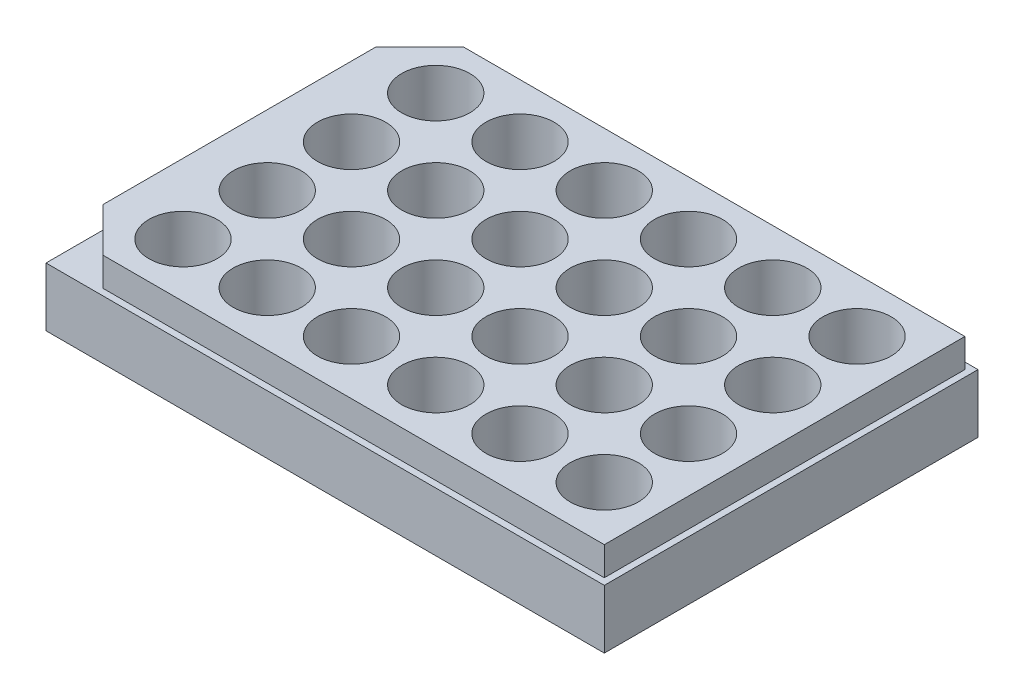
ISO-10303-21;
HEADER;
FILE_DESCRIPTION(('STEP AP214'),'2;1');
FILE_NAME('part.step','',(''),(''),'','','');
FILE_SCHEMA(('AUTOMOTIVE_DESIGN { 1 0 10303 214 1 1 1 1 }'));
ENDSEC;
DATA;
#1=APPLICATION_CONTEXT('core data for automotive mechanical design processes');
#2=APPLICATION_PROTOCOL_DEFINITION('international standard','automotive_design',2000,#1);
#3=PRODUCT_CONTEXT('',#1,'mechanical');
#4=PRODUCT('Part','Part','',(#3));
#5=PRODUCT_RELATED_PRODUCT_CATEGORY('part','',(#4));
#6=PRODUCT_DEFINITION_FORMATION('','',#4);
#7=PRODUCT_DEFINITION_CONTEXT('part definition',#1,'design');
#8=PRODUCT_DEFINITION('design','',#6,#7);
#9=PRODUCT_DEFINITION_SHAPE('','',#8);
#10=(LENGTH_UNIT() NAMED_UNIT(*) SI_UNIT(.MILLI.,.METRE.));
#11=(NAMED_UNIT(*) PLANE_ANGLE_UNIT() SI_UNIT($,.RADIAN.));
#12=(NAMED_UNIT(*) SI_UNIT($,.STERADIAN.) SOLID_ANGLE_UNIT());
#13=UNCERTAINTY_MEASURE_WITH_UNIT(LENGTH_MEASURE(1.E-05),#10,'distance_accuracy_value','');
#14=(GEOMETRIC_REPRESENTATION_CONTEXT(3) GLOBAL_UNCERTAINTY_ASSIGNED_CONTEXT((#13)) GLOBAL_UNIT_ASSIGNED_CONTEXT((#10,
#11,#12)) REPRESENTATION_CONTEXT('',''));
#15=CARTESIAN_POINT('',(0.,0.,0.));
#16=DIRECTION('',(0.,0.,1.));
#17=DIRECTION('',(1.,0.,0.));
#18=AXIS2_PLACEMENT_3D('',#15,#16,#17);
#19=CARTESIAN_POINT('',(0.,20.02,0.));
#20=DIRECTION('',(0.,1.,0.));
#21=DIRECTION('',(0.,0.,1.));
#22=AXIS2_PLACEMENT_3D('',#19,#20,#21);
#23=PLANE('',#22);
#24=DIRECTION('',(-0.707106781186548,0.,-0.707106781186547));
#25=VECTOR('',#24,1.);
#26=CARTESIAN_POINT('',(-62.445,20.02,31.3));
#27=LINE('',#26,#25);
#28=CARTESIAN_POINT('',(-52.445,20.02,41.3));
#29=VERTEX_POINT('',#28);
#30=CARTESIAN_POINT('',(-62.445,20.02,31.3));
#31=VERTEX_POINT('',#30);
#32=EDGE_CURVE('E117',#29,#31,#27,.T.);
#33=ORIENTED_EDGE('',*,*,#32,.F.);
#34=DIRECTION('',(1.,0.,0.));
#35=VECTOR('',#34,1.);
#36=CARTESIAN_POINT('',(62.445,20.02,41.3));
#37=LINE('',#36,#35);
#38=CARTESIAN_POINT('',(62.445,20.02,41.3));
#39=VERTEX_POINT('',#38);
#40=EDGE_CURVE('E125',#29,#39,#37,.T.);
#41=ORIENTED_EDGE('',*,*,#40,.T.);
#42=DIRECTION('',(0.,0.,-1.));
#43=VECTOR('',#42,1.);
#44=CARTESIAN_POINT('',(62.445,20.02,-41.3));
#45=LINE('',#44,#43);
#46=CARTESIAN_POINT('',(62.445,20.02,-41.3));
#47=VERTEX_POINT('',#46);
#48=EDGE_CURVE('E141',#39,#47,#45,.T.);
#49=ORIENTED_EDGE('',*,*,#48,.T.);
#50=DIRECTION('',(-1.,0.,0.));
#51=VECTOR('',#50,1.);
#52=CARTESIAN_POINT('',(62.445,20.02,-41.3));
#53=LINE('',#52,#51);
#54=CARTESIAN_POINT('',(-52.445,20.02,-41.3));
#55=VERTEX_POINT('',#54);
#56=EDGE_CURVE('E144',#47,#55,#53,.T.);
#57=ORIENTED_EDGE('',*,*,#56,.T.);
#58=DIRECTION('',(0.707106781186548,0.,-0.707106781186547));
#59=VECTOR('',#58,1.);
#60=CARTESIAN_POINT('',(-52.445,20.02,-41.3));
#61=LINE('',#60,#59);
#62=CARTESIAN_POINT('',(-62.445,20.02,-31.3));
#63=VERTEX_POINT('',#62);
#64=EDGE_CURVE('E714',#63,#55,#61,.T.);
#65=ORIENTED_EDGE('',*,*,#64,.F.);
#66=DIRECTION('',(0.,0.,1.));
#67=VECTOR('',#66,1.);
#68=CARTESIAN_POINT('',(-62.445,20.02,-41.3));
#69=LINE('',#68,#67);
#70=EDGE_CURVE('E148',#63,#31,#69,.T.);
#71=ORIENTED_EDGE('',*,*,#70,.T.);
#72=EDGE_LOOP('',(#33,#41,#49,#57,#65,#71));
#73=FACE_BOUND('',#72,.T.);
#74=CARTESIAN_POINT('',(-46.425,20.02,-28.96));
#75=DIRECTION('',(0.,1.,0.));
#76=DIRECTION('',(0.,0.,1.));
#77=AXIS2_PLACEMENT_3D('',#74,#75,#76);
#78=CIRCLE('',#77,7.81);
#79=CARTESIAN_POINT('',(-46.425,20.02,-21.15));
#80=VERTEX_POINT('',#79);
#81=EDGE_CURVE('E297',#80,#80,#78,.T.);
#82=ORIENTED_EDGE('',*,*,#81,.F.);
#83=EDGE_LOOP('',(#82));
#84=FACE_BOUND('',#83,.T.);
#85=CARTESIAN_POINT('',(-27.125,20.02,-28.96));
#86=DIRECTION('',(0.,1.,0.));
#87=DIRECTION('',(0.,0.,1.));
#88=AXIS2_PLACEMENT_3D('',#85,#86,#87);
#89=CIRCLE('',#88,7.81);
#90=CARTESIAN_POINT('',(-27.125,20.02,-21.15));
#91=VERTEX_POINT('',#90);
#92=EDGE_CURVE('E291',#91,#91,#89,.T.);
#93=ORIENTED_EDGE('',*,*,#92,.F.);
#94=EDGE_LOOP('',(#93));
#95=FACE_BOUND('',#94,.T.);
#96=CARTESIAN_POINT('',(-7.82499999999999,20.02,-28.96));
#97=DIRECTION('',(0.,1.,0.));
#98=DIRECTION('',(0.,0.,1.));
#99=AXIS2_PLACEMENT_3D('',#96,#97,#98);
#100=CIRCLE('',#99,7.81);
#101=CARTESIAN_POINT('',(-7.82499999999999,20.02,-21.15));
#102=VERTEX_POINT('',#101);
#103=EDGE_CURVE('E285',#102,#102,#100,.T.);
#104=ORIENTED_EDGE('',*,*,#103,.F.);
#105=EDGE_LOOP('',(#104));
#106=FACE_BOUND('',#105,.T.);
#107=CARTESIAN_POINT('',(11.475,20.02,-28.96));
#108=DIRECTION('',(0.,1.,0.));
#109=DIRECTION('',(0.,0.,1.));
#110=AXIS2_PLACEMENT_3D('',#107,#108,#109);
#111=CIRCLE('',#110,7.81);
#112=CARTESIAN_POINT('',(11.475,20.02,-21.15));
#113=VERTEX_POINT('',#112);
#114=EDGE_CURVE('E279',#113,#113,#111,.T.);
#115=ORIENTED_EDGE('',*,*,#114,.F.);
#116=EDGE_LOOP('',(#115));
#117=FACE_BOUND('',#116,.T.);
#118=CARTESIAN_POINT('',(30.775,20.02,-28.96));
#119=DIRECTION('',(0.,1.,0.));
#120=DIRECTION('',(0.,0.,1.));
#121=AXIS2_PLACEMENT_3D('',#118,#119,#120);
#122=CIRCLE('',#121,7.81);
#123=CARTESIAN_POINT('',(30.775,20.02,-21.15));
#124=VERTEX_POINT('',#123);
#125=EDGE_CURVE('E273',#124,#124,#122,.T.);
#126=ORIENTED_EDGE('',*,*,#125,.F.);
#127=EDGE_LOOP('',(#126));
#128=FACE_BOUND('',#127,.T.);
#129=CARTESIAN_POINT('',(50.075,20.02,-28.96));
#130=DIRECTION('',(0.,1.,0.));
#131=DIRECTION('',(0.,0.,1.));
#132=AXIS2_PLACEMENT_3D('',#129,#130,#131);
#133=CIRCLE('',#132,7.81);
#134=CARTESIAN_POINT('',(50.075,20.02,-21.15));
#135=VERTEX_POINT('',#134);
#136=EDGE_CURVE('E267',#135,#135,#133,.T.);
#137=ORIENTED_EDGE('',*,*,#136,.F.);
#138=EDGE_LOOP('',(#137));
#139=FACE_BOUND('',#138,.T.);
#140=CARTESIAN_POINT('',(-27.1249999999998,20.02,-9.65999999999998));
#141=DIRECTION('',(0.,1.,0.));
#142=DIRECTION('',(0.,0.,1.));
#143=AXIS2_PLACEMENT_3D('',#140,#141,#142);
#144=CIRCLE('',#143,7.81);
#145=CARTESIAN_POINT('',(-27.1249999999998,20.02,-1.84999999999998));
#146=VERTEX_POINT('',#145);
#147=EDGE_CURVE('E261',#146,#146,#144,.T.);
#148=ORIENTED_EDGE('',*,*,#147,.F.);
#149=EDGE_LOOP('',(#148));
#150=FACE_BOUND('',#149,.T.);
#151=CARTESIAN_POINT('',(-7.82499999999979,20.02,-9.65999999999998));
#152=DIRECTION('',(0.,1.,0.));
#153=DIRECTION('',(0.,0.,1.));
#154=AXIS2_PLACEMENT_3D('',#151,#152,#153);
#155=CIRCLE('',#154,7.81);
#156=CARTESIAN_POINT('',(-7.82499999999979,20.02,-1.84999999999999));
#157=VERTEX_POINT('',#156);
#158=EDGE_CURVE('E255',#157,#157,#155,.T.);
#159=ORIENTED_EDGE('',*,*,#158,.F.);
#160=EDGE_LOOP('',(#159));
#161=FACE_BOUND('',#160,.T.);
#162=CARTESIAN_POINT('',(11.4750000000002,20.02,-9.65999999999998));
#163=DIRECTION('',(0.,1.,0.));
#164=DIRECTION('',(0.,0.,1.));
#165=AXIS2_PLACEMENT_3D('',#162,#163,#164);
#166=CIRCLE('',#165,7.81);
#167=CARTESIAN_POINT('',(11.4750000000002,20.02,-1.84999999999999));
#168=VERTEX_POINT('',#167);
#169=EDGE_CURVE('E249',#168,#168,#166,.T.);
#170=ORIENTED_EDGE('',*,*,#169,.F.);
#171=EDGE_LOOP('',(#170));
#172=FACE_BOUND('',#171,.T.);
#173=CARTESIAN_POINT('',(30.7750000000002,20.02,-9.65999999999998));
#174=DIRECTION('',(0.,1.,0.));
#175=DIRECTION('',(0.,0.,1.));
#176=AXIS2_PLACEMENT_3D('',#173,#174,#175);
#177=CIRCLE('',#176,7.81);
#178=CARTESIAN_POINT('',(30.7750000000002,20.02,-1.84999999999999));
#179=VERTEX_POINT('',#178);
#180=EDGE_CURVE('E243',#179,#179,#177,.T.);
#181=ORIENTED_EDGE('',*,*,#180,.F.);
#182=EDGE_LOOP('',(#181));
#183=FACE_BOUND('',#182,.T.);
#184=CARTESIAN_POINT('',(50.0750000000002,20.02,-9.65999999999998));
#185=DIRECTION('',(0.,1.,0.));
#186=DIRECTION('',(0.,0.,1.));
#187=AXIS2_PLACEMENT_3D('',#184,#185,#186);
#188=CIRCLE('',#187,7.81);
#189=CARTESIAN_POINT('',(50.0750000000002,20.02,-1.84999999999999));
#190=VERTEX_POINT('',#189);
#191=EDGE_CURVE('E237',#190,#190,#188,.T.);
#192=ORIENTED_EDGE('',*,*,#191,.F.);
#193=EDGE_LOOP('',(#192));
#194=FACE_BOUND('',#193,.T.);
#195=CARTESIAN_POINT('',(-27.1249999999996,20.02,9.64000000000002));
#196=DIRECTION('',(0.,1.,0.));
#197=DIRECTION('',(0.,0.,1.));
#198=AXIS2_PLACEMENT_3D('',#195,#196,#197);
#199=CIRCLE('',#198,7.81);
#200=CARTESIAN_POINT('',(-27.1249999999996,20.02,17.45));
#201=VERTEX_POINT('',#200);
#202=EDGE_CURVE('E231',#201,#201,#199,.T.);
#203=ORIENTED_EDGE('',*,*,#202,.F.);
#204=EDGE_LOOP('',(#203));
#205=FACE_BOUND('',#204,.T.);
#206=CARTESIAN_POINT('',(-7.82499999999959,20.02,9.64000000000002));
#207=DIRECTION('',(0.,1.,0.));
#208=DIRECTION('',(0.,0.,1.));
#209=AXIS2_PLACEMENT_3D('',#206,#207,#208);
#210=CIRCLE('',#209,7.81);
#211=CARTESIAN_POINT('',(-7.82499999999959,20.02,17.45));
#212=VERTEX_POINT('',#211);
#213=EDGE_CURVE('E225',#212,#212,#210,.T.);
#214=ORIENTED_EDGE('',*,*,#213,.F.);
#215=EDGE_LOOP('',(#214));
#216=FACE_BOUND('',#215,.T.);
#217=CARTESIAN_POINT('',(11.4750000000004,20.02,9.64000000000002));
#218=DIRECTION('',(0.,1.,0.));
#219=DIRECTION('',(0.,0.,1.));
#220=AXIS2_PLACEMENT_3D('',#217,#218,#219);
#221=CIRCLE('',#220,7.81);
#222=CARTESIAN_POINT('',(11.4750000000004,20.02,17.45));
#223=VERTEX_POINT('',#222);
#224=EDGE_CURVE('E219',#223,#223,#221,.T.);
#225=ORIENTED_EDGE('',*,*,#224,.F.);
#226=EDGE_LOOP('',(#225));
#227=FACE_BOUND('',#226,.T.);
#228=CARTESIAN_POINT('',(30.7750000000004,20.02,9.64000000000002));
#229=DIRECTION('',(0.,1.,0.));
#230=DIRECTION('',(0.,0.,1.));
#231=AXIS2_PLACEMENT_3D('',#228,#229,#230);
#232=CIRCLE('',#231,7.81);
#233=CARTESIAN_POINT('',(30.7750000000004,20.02,17.45));
#234=VERTEX_POINT('',#233);
#235=EDGE_CURVE('E213',#234,#234,#232,.T.);
#236=ORIENTED_EDGE('',*,*,#235,.F.);
#237=EDGE_LOOP('',(#236));
#238=FACE_BOUND('',#237,.T.);
#239=CARTESIAN_POINT('',(50.0750000000004,20.02,9.64000000000002));
#240=DIRECTION('',(0.,1.,0.));
#241=DIRECTION('',(0.,0.,1.));
#242=AXIS2_PLACEMENT_3D('',#239,#240,#241);
#243=CIRCLE('',#242,7.81);
#244=CARTESIAN_POINT('',(50.0750000000004,20.02,17.45));
#245=VERTEX_POINT('',#244);
#246=EDGE_CURVE('E207',#245,#245,#243,.T.);
#247=ORIENTED_EDGE('',*,*,#246,.F.);
#248=EDGE_LOOP('',(#247));
#249=FACE_BOUND('',#248,.T.);
#250=CARTESIAN_POINT('',(-27.1249999999994,20.02,28.94));
#251=DIRECTION('',(0.,1.,0.));
#252=DIRECTION('',(0.,0.,1.));
#253=AXIS2_PLACEMENT_3D('',#250,#251,#252);
#254=CIRCLE('',#253,7.81);
#255=CARTESIAN_POINT('',(-27.1249999999994,20.02,36.75));
#256=VERTEX_POINT('',#255);
#257=EDGE_CURVE('E201',#256,#256,#254,.T.);
#258=ORIENTED_EDGE('',*,*,#257,.F.);
#259=EDGE_LOOP('',(#258));
#260=FACE_BOUND('',#259,.T.);
#261=CARTESIAN_POINT('',(-7.82499999999939,20.02,28.94));
#262=DIRECTION('',(0.,1.,0.));
#263=DIRECTION('',(0.,0.,1.));
#264=AXIS2_PLACEMENT_3D('',#261,#262,#263);
#265=CIRCLE('',#264,7.81);
#266=CARTESIAN_POINT('',(-7.82499999999939,20.02,36.75));
#267=VERTEX_POINT('',#266);
#268=EDGE_CURVE('E195',#267,#267,#265,.T.);
#269=ORIENTED_EDGE('',*,*,#268,.F.);
#270=EDGE_LOOP('',(#269));
#271=FACE_BOUND('',#270,.T.);
#272=CARTESIAN_POINT('',(11.4750000000006,20.02,28.94));
#273=DIRECTION('',(0.,1.,0.));
#274=DIRECTION('',(0.,0.,1.));
#275=AXIS2_PLACEMENT_3D('',#272,#273,#274);
#276=CIRCLE('',#275,7.81);
#277=CARTESIAN_POINT('',(11.4750000000006,20.02,36.75));
#278=VERTEX_POINT('',#277);
#279=EDGE_CURVE('E189',#278,#278,#276,.T.);
#280=ORIENTED_EDGE('',*,*,#279,.F.);
#281=EDGE_LOOP('',(#280));
#282=FACE_BOUND('',#281,.T.);
#283=CARTESIAN_POINT('',(30.7750000000006,20.02,28.94));
#284=DIRECTION('',(0.,1.,0.));
#285=DIRECTION('',(0.,0.,1.));
#286=AXIS2_PLACEMENT_3D('',#283,#284,#285);
#287=CIRCLE('',#286,7.81);
#288=CARTESIAN_POINT('',(30.7750000000006,20.02,36.75));
#289=VERTEX_POINT('',#288);
#290=EDGE_CURVE('E183',#289,#289,#287,.T.);
#291=ORIENTED_EDGE('',*,*,#290,.F.);
#292=EDGE_LOOP('',(#291));
#293=FACE_BOUND('',#292,.T.);
#294=CARTESIAN_POINT('',(50.0750000000006,20.02,28.94));
#295=DIRECTION('',(0.,1.,0.));
#296=DIRECTION('',(0.,0.,1.));
#297=AXIS2_PLACEMENT_3D('',#294,#295,#296);
#298=CIRCLE('',#297,7.81);
#299=CARTESIAN_POINT('',(50.0750000000006,20.02,36.75));
#300=VERTEX_POINT('',#299);
#301=EDGE_CURVE('E177',#300,#300,#298,.T.);
#302=ORIENTED_EDGE('',*,*,#301,.F.);
#303=EDGE_LOOP('',(#302));
#304=FACE_BOUND('',#303,.T.);
#305=CARTESIAN_POINT('',(-46.4249999999998,20.02,-9.65999999999998));
#306=DIRECTION('',(0.,1.,0.));
#307=DIRECTION('',(0.,0.,1.));
#308=AXIS2_PLACEMENT_3D('',#305,#306,#307);
#309=CIRCLE('',#308,7.81);
#310=CARTESIAN_POINT('',(-46.4249999999998,20.02,-1.84999999999999));
#311=VERTEX_POINT('',#310);
#312=EDGE_CURVE('E171',#311,#311,#309,.T.);
#313=ORIENTED_EDGE('',*,*,#312,.F.);
#314=EDGE_LOOP('',(#313));
#315=FACE_BOUND('',#314,.T.);
#316=CARTESIAN_POINT('',(-46.4249999999996,20.02,9.64000000000002));
#317=DIRECTION('',(0.,1.,0.));
#318=DIRECTION('',(0.,0.,1.));
#319=AXIS2_PLACEMENT_3D('',#316,#317,#318);
#320=CIRCLE('',#319,7.81);
#321=CARTESIAN_POINT('',(-46.4249999999996,20.02,17.45));
#322=VERTEX_POINT('',#321);
#323=EDGE_CURVE('E165',#322,#322,#320,.T.);
#324=ORIENTED_EDGE('',*,*,#323,.F.);
#325=EDGE_LOOP('',(#324));
#326=FACE_BOUND('',#325,.T.);
#327=CARTESIAN_POINT('',(-46.4249999999994,20.02,28.94));
#328=DIRECTION('',(0.,1.,0.));
#329=DIRECTION('',(0.,0.,1.));
#330=AXIS2_PLACEMENT_3D('',#327,#328,#329);
#331=CIRCLE('',#330,7.81);
#332=CARTESIAN_POINT('',(-46.4249999999994,20.02,36.75));
#333=VERTEX_POINT('',#332);
#334=EDGE_CURVE('E161',#333,#333,#331,.T.);
#335=ORIENTED_EDGE('',*,*,#334,.F.);
#336=EDGE_LOOP('',(#335));
#337=FACE_BOUND('',#336,.T.);
#338=ADVANCED_FACE('F36',(#73,#84,#95,#106,#117,#128,#139,#150,#161,#172,#183,#194,#205,#216,
#227,#238,#249,#260,#271,#282,#293,#304,#315,#326,#337),#23,.T.);
#339=CARTESIAN_POINT('',(63.945,20.02,-42.8));
#340=DIRECTION('',(-1.,0.,0.));
#341=DIRECTION('',(0.,0.,1.));
#342=AXIS2_PLACEMENT_3D('',#339,#340,#341);
#343=PLANE('',#342);
#344=DIRECTION('',(0.,-1.,0.));
#345=VECTOR('',#344,1.);
#346=CARTESIAN_POINT('',(63.945,20.02,-42.8));
#347=LINE('',#346,#345);
#348=CARTESIAN_POINT('',(63.945,13.45,-42.8));
#349=VERTEX_POINT('',#348);
#350=CARTESIAN_POINT('',(63.945,0.,-42.8));
#351=VERTEX_POINT('',#350);
#352=EDGE_CURVE('E11',#349,#351,#347,.T.);
#353=ORIENTED_EDGE('',*,*,#352,.F.);
#354=DIRECTION('',(0.,0.,-1.));
#355=VECTOR('',#354,1.);
#356=CARTESIAN_POINT('',(63.945,13.45,-42.8));
#357=LINE('',#356,#355);
#358=CARTESIAN_POINT('',(63.945,13.45,42.8));
#359=VERTEX_POINT('',#358);
#360=EDGE_CURVE('E157',#359,#349,#357,.T.);
#361=ORIENTED_EDGE('',*,*,#360,.F.);
#362=DIRECTION('',(0.,-1.,0.));
#363=VECTOR('',#362,1.);
#364=CARTESIAN_POINT('',(63.945,20.02,42.8));
#365=LINE('',#364,#363);
#366=CARTESIAN_POINT('',(63.945,0.,42.8));
#367=VERTEX_POINT('',#366);
#368=EDGE_CURVE('E317',#359,#367,#365,.T.);
#369=ORIENTED_EDGE('',*,*,#368,.T.);
#370=DIRECTION('',(0.,0.,-1.));
#371=VECTOR('',#370,1.);
#372=CARTESIAN_POINT('',(63.945,0.,-42.8));
#373=LINE('',#372,#371);
#374=EDGE_CURVE('E303',#367,#351,#373,.T.);
#375=ORIENTED_EDGE('',*,*,#374,.T.);
#376=EDGE_LOOP('',(#353,#361,#369,#375));
#377=FACE_BOUND('',#376,.T.);
#378=ADVANCED_FACE('F38',(#377),#343,.F.);
#379=CARTESIAN_POINT('',(-63.945,20.02,-42.8));
#380=DIRECTION('',(0.,0.,1.));
#381=DIRECTION('',(1.,0.,0.));
#382=AXIS2_PLACEMENT_3D('',#379,#380,#381);
#383=PLANE('',#382);
#384=DIRECTION('',(0.,-1.,0.));
#385=VECTOR('',#384,1.);
#386=CARTESIAN_POINT('',(-63.945,20.02,-42.8));
#387=LINE('',#386,#385);
#388=CARTESIAN_POINT('',(-63.945,13.45,-42.8));
#389=VERTEX_POINT('',#388);
#390=CARTESIAN_POINT('',(-63.945,0.,-42.8));
#391=VERTEX_POINT('',#390);
#392=EDGE_CURVE('E44',#389,#391,#387,.T.);
#393=ORIENTED_EDGE('',*,*,#392,.F.);
#394=DIRECTION('',(-1.,0.,0.));
#395=VECTOR('',#394,1.);
#396=CARTESIAN_POINT('',(63.945,13.45,-42.8));
#397=LINE('',#396,#395);
#398=EDGE_CURVE('E159',#349,#389,#397,.T.);
#399=ORIENTED_EDGE('',*,*,#398,.F.);
#400=ORIENTED_EDGE('',*,*,#352,.T.);
#401=DIRECTION('',(-1.,0.,0.));
#402=VECTOR('',#401,1.);
#403=CARTESIAN_POINT('',(-63.945,0.,-42.8));
#404=LINE('',#403,#402);
#405=EDGE_CURVE('E308',#351,#391,#404,.T.);
#406=ORIENTED_EDGE('',*,*,#405,.T.);
#407=EDGE_LOOP('',(#393,#399,#400,#406));
#408=FACE_BOUND('',#407,.T.);
#409=ADVANCED_FACE('F330',(#408),#383,.F.);
#410=CARTESIAN_POINT('',(-63.945,20.02,-42.8));
#411=DIRECTION('',(1.,0.,0.));
#412=DIRECTION('',(0.,0.,-1.));
#413=AXIS2_PLACEMENT_3D('',#410,#411,#412);
#414=PLANE('',#413);
#415=DIRECTION('',(0.,-1.,0.));
#416=VECTOR('',#415,1.);
#417=CARTESIAN_POINT('',(-63.945,20.02,42.8));
#418=LINE('',#417,#416);
#419=CARTESIAN_POINT('',(-63.945,13.45,42.8));
#420=VERTEX_POINT('',#419);
#421=CARTESIAN_POINT('',(-63.945,0.,42.8));
#422=VERTEX_POINT('',#421);
#423=EDGE_CURVE('E319',#420,#422,#418,.T.);
#424=ORIENTED_EDGE('',*,*,#423,.F.);
#425=DIRECTION('',(0.,0.,1.));
#426=VECTOR('',#425,1.);
#427=CARTESIAN_POINT('',(-63.945,13.45,-42.8));
#428=LINE('',#427,#426);
#429=EDGE_CURVE('E152',#389,#420,#428,.T.);
#430=ORIENTED_EDGE('',*,*,#429,.F.);
#431=ORIENTED_EDGE('',*,*,#392,.T.);
#432=DIRECTION('',(0.,0.,1.));
#433=VECTOR('',#432,1.);
#434=CARTESIAN_POINT('',(-63.945,0.,-42.8));
#435=LINE('',#434,#433);
#436=EDGE_CURVE('E311',#391,#422,#435,.T.);
#437=ORIENTED_EDGE('',*,*,#436,.T.);
#438=EDGE_LOOP('',(#424,#430,#431,#437));
#439=FACE_BOUND('',#438,.T.);
#440=ADVANCED_FACE('F324',(#439),#414,.F.);
#441=CARTESIAN_POINT('',(-63.945,20.02,42.8));
#442=DIRECTION('',(0.,0.,-1.));
#443=DIRECTION('',(-1.,0.,0.));
#444=AXIS2_PLACEMENT_3D('',#441,#442,#443);
#445=PLANE('',#444);
#446=ORIENTED_EDGE('',*,*,#368,.F.);
#447=DIRECTION('',(1.,0.,0.));
#448=VECTOR('',#447,1.);
#449=CARTESIAN_POINT('',(63.945,13.45,42.8));
#450=LINE('',#449,#448);
#451=EDGE_CURVE('E155',#420,#359,#450,.T.);
#452=ORIENTED_EDGE('',*,*,#451,.F.);
#453=ORIENTED_EDGE('',*,*,#423,.T.);
#454=DIRECTION('',(1.,0.,0.));
#455=VECTOR('',#454,1.);
#456=CARTESIAN_POINT('',(-63.945,0.,42.8));
#457=LINE('',#456,#455);
#458=EDGE_CURVE('E314',#422,#367,#457,.T.);
#459=ORIENTED_EDGE('',*,*,#458,.T.);
#460=EDGE_LOOP('',(#446,#452,#453,#459));
#461=FACE_BOUND('',#460,.T.);
#462=ADVANCED_FACE('F337',(#461),#445,.F.);
#463=CARTESIAN_POINT('',(0.,0.,0.));
#464=DIRECTION('',(0.,1.,0.));
#465=DIRECTION('',(0.,0.,1.));
#466=AXIS2_PLACEMENT_3D('',#463,#464,#465);
#467=PLANE('',#466);
#468=CARTESIAN_POINT('',(-46.4249999999994,0.,28.94));
#469=DIRECTION('',(0.,1.,0.));
#470=DIRECTION('',(0.,0.,1.));
#471=AXIS2_PLACEMENT_3D('',#468,#469,#470);
#472=CIRCLE('',#471,7.81);
#473=CARTESIAN_POINT('',(-46.4249999999994,0.,36.75));
#474=VERTEX_POINT('',#473);
#475=EDGE_CURVE('E162',#474,#474,#472,.T.);
#476=ORIENTED_EDGE('',*,*,#475,.T.);
#477=EDGE_LOOP('',(#476));
#478=FACE_BOUND('',#477,.T.);
#479=CARTESIAN_POINT('',(-46.4249999999996,0.,9.64000000000002));
#480=DIRECTION('',(0.,1.,0.));
#481=DIRECTION('',(0.,0.,1.));
#482=AXIS2_PLACEMENT_3D('',#479,#480,#481);
#483=CIRCLE('',#482,7.81);
#484=CARTESIAN_POINT('',(-46.4249999999996,0.,17.45));
#485=VERTEX_POINT('',#484);
#486=EDGE_CURVE('E168',#485,#485,#483,.T.);
#487=ORIENTED_EDGE('',*,*,#486,.T.);
#488=EDGE_LOOP('',(#487));
#489=FACE_BOUND('',#488,.T.);
#490=CARTESIAN_POINT('',(-46.4249999999998,0.,-9.65999999999998));
#491=DIRECTION('',(0.,1.,0.));
#492=DIRECTION('',(0.,0.,1.));
#493=AXIS2_PLACEMENT_3D('',#490,#491,#492);
#494=CIRCLE('',#493,7.81);
#495=CARTESIAN_POINT('',(-46.4249999999998,0.,-1.84999999999999));
#496=VERTEX_POINT('',#495);
#497=EDGE_CURVE('E174',#496,#496,#494,.T.);
#498=ORIENTED_EDGE('',*,*,#497,.T.);
#499=EDGE_LOOP('',(#498));
#500=FACE_BOUND('',#499,.T.);
#501=CARTESIAN_POINT('',(50.0750000000006,0.,28.94));
#502=DIRECTION('',(0.,1.,0.));
#503=DIRECTION('',(0.,0.,1.));
#504=AXIS2_PLACEMENT_3D('',#501,#502,#503);
#505=CIRCLE('',#504,7.81);
#506=CARTESIAN_POINT('',(50.0750000000006,0.,36.75));
#507=VERTEX_POINT('',#506);
#508=EDGE_CURVE('E180',#507,#507,#505,.T.);
#509=ORIENTED_EDGE('',*,*,#508,.T.);
#510=EDGE_LOOP('',(#509));
#511=FACE_BOUND('',#510,.T.);
#512=CARTESIAN_POINT('',(30.7750000000006,0.,28.94));
#513=DIRECTION('',(0.,1.,0.));
#514=DIRECTION('',(0.,0.,1.));
#515=AXIS2_PLACEMENT_3D('',#512,#513,#514);
#516=CIRCLE('',#515,7.81);
#517=CARTESIAN_POINT('',(30.7750000000006,0.,36.75));
#518=VERTEX_POINT('',#517);
#519=EDGE_CURVE('E186',#518,#518,#516,.T.);
#520=ORIENTED_EDGE('',*,*,#519,.T.);
#521=EDGE_LOOP('',(#520));
#522=FACE_BOUND('',#521,.T.);
#523=CARTESIAN_POINT('',(11.4750000000006,0.,28.94));
#524=DIRECTION('',(0.,1.,0.));
#525=DIRECTION('',(0.,0.,1.));
#526=AXIS2_PLACEMENT_3D('',#523,#524,#525);
#527=CIRCLE('',#526,7.81);
#528=CARTESIAN_POINT('',(11.4750000000006,0.,36.75));
#529=VERTEX_POINT('',#528);
#530=EDGE_CURVE('E192',#529,#529,#527,.T.);
#531=ORIENTED_EDGE('',*,*,#530,.T.);
#532=EDGE_LOOP('',(#531));
#533=FACE_BOUND('',#532,.T.);
#534=CARTESIAN_POINT('',(-7.82499999999939,0.,28.94));
#535=DIRECTION('',(0.,1.,0.));
#536=DIRECTION('',(0.,0.,1.));
#537=AXIS2_PLACEMENT_3D('',#534,#535,#536);
#538=CIRCLE('',#537,7.81);
#539=CARTESIAN_POINT('',(-7.82499999999939,0.,36.75));
#540=VERTEX_POINT('',#539);
#541=EDGE_CURVE('E198',#540,#540,#538,.T.);
#542=ORIENTED_EDGE('',*,*,#541,.T.);
#543=EDGE_LOOP('',(#542));
#544=FACE_BOUND('',#543,.T.);
#545=CARTESIAN_POINT('',(-27.1249999999994,0.,28.94));
#546=DIRECTION('',(0.,1.,0.));
#547=DIRECTION('',(0.,0.,1.));
#548=AXIS2_PLACEMENT_3D('',#545,#546,#547);
#549=CIRCLE('',#548,7.81);
#550=CARTESIAN_POINT('',(-27.1249999999994,0.,36.75));
#551=VERTEX_POINT('',#550);
#552=EDGE_CURVE('E204',#551,#551,#549,.T.);
#553=ORIENTED_EDGE('',*,*,#552,.T.);
#554=EDGE_LOOP('',(#553));
#555=FACE_BOUND('',#554,.T.);
#556=CARTESIAN_POINT('',(50.0750000000004,0.,9.64000000000002));
#557=DIRECTION('',(0.,1.,0.));
#558=DIRECTION('',(0.,0.,1.));
#559=AXIS2_PLACEMENT_3D('',#556,#557,#558);
#560=CIRCLE('',#559,7.81);
#561=CARTESIAN_POINT('',(50.0750000000004,0.,17.45));
#562=VERTEX_POINT('',#561);
#563=EDGE_CURVE('E210',#562,#562,#560,.T.);
#564=ORIENTED_EDGE('',*,*,#563,.T.);
#565=EDGE_LOOP('',(#564));
#566=FACE_BOUND('',#565,.T.);
#567=CARTESIAN_POINT('',(30.7750000000004,0.,9.64000000000002));
#568=DIRECTION('',(0.,1.,0.));
#569=DIRECTION('',(0.,0.,1.));
#570=AXIS2_PLACEMENT_3D('',#567,#568,#569);
#571=CIRCLE('',#570,7.81);
#572=CARTESIAN_POINT('',(30.7750000000004,0.,17.45));
#573=VERTEX_POINT('',#572);
#574=EDGE_CURVE('E216',#573,#573,#571,.T.);
#575=ORIENTED_EDGE('',*,*,#574,.T.);
#576=EDGE_LOOP('',(#575));
#577=FACE_BOUND('',#576,.T.);
#578=CARTESIAN_POINT('',(11.4750000000004,0.,9.64000000000002));
#579=DIRECTION('',(0.,1.,0.));
#580=DIRECTION('',(0.,0.,1.));
#581=AXIS2_PLACEMENT_3D('',#578,#579,#580);
#582=CIRCLE('',#581,7.81);
#583=CARTESIAN_POINT('',(11.4750000000004,0.,17.45));
#584=VERTEX_POINT('',#583);
#585=EDGE_CURVE('E222',#584,#584,#582,.T.);
#586=ORIENTED_EDGE('',*,*,#585,.T.);
#587=EDGE_LOOP('',(#586));
#588=FACE_BOUND('',#587,.T.);
#589=CARTESIAN_POINT('',(-7.82499999999959,0.,9.64000000000002));
#590=DIRECTION('',(0.,1.,0.));
#591=DIRECTION('',(0.,0.,1.));
#592=AXIS2_PLACEMENT_3D('',#589,#590,#591);
#593=CIRCLE('',#592,7.81);
#594=CARTESIAN_POINT('',(-7.82499999999959,0.,17.45));
#595=VERTEX_POINT('',#594);
#596=EDGE_CURVE('E228',#595,#595,#593,.T.);
#597=ORIENTED_EDGE('',*,*,#596,.T.);
#598=EDGE_LOOP('',(#597));
#599=FACE_BOUND('',#598,.T.);
#600=CARTESIAN_POINT('',(-27.1249999999996,0.,9.64000000000002));
#601=DIRECTION('',(0.,1.,0.));
#602=DIRECTION('',(0.,0.,1.));
#603=AXIS2_PLACEMENT_3D('',#600,#601,#602);
#604=CIRCLE('',#603,7.81);
#605=CARTESIAN_POINT('',(-27.1249999999996,0.,17.45));
#606=VERTEX_POINT('',#605);
#607=EDGE_CURVE('E234',#606,#606,#604,.T.);
#608=ORIENTED_EDGE('',*,*,#607,.T.);
#609=EDGE_LOOP('',(#608));
#610=FACE_BOUND('',#609,.T.);
#611=CARTESIAN_POINT('',(50.0750000000002,0.,-9.65999999999998));
#612=DIRECTION('',(0.,1.,0.));
#613=DIRECTION('',(0.,0.,1.));
#614=AXIS2_PLACEMENT_3D('',#611,#612,#613);
#615=CIRCLE('',#614,7.81);
#616=CARTESIAN_POINT('',(50.0750000000002,0.,-1.84999999999999));
#617=VERTEX_POINT('',#616);
#618=EDGE_CURVE('E240',#617,#617,#615,.T.);
#619=ORIENTED_EDGE('',*,*,#618,.T.);
#620=EDGE_LOOP('',(#619));
#621=FACE_BOUND('',#620,.T.);
#622=CARTESIAN_POINT('',(30.7750000000002,0.,-9.65999999999998));
#623=DIRECTION('',(0.,1.,0.));
#624=DIRECTION('',(0.,0.,1.));
#625=AXIS2_PLACEMENT_3D('',#622,#623,#624);
#626=CIRCLE('',#625,7.81);
#627=CARTESIAN_POINT('',(30.7750000000002,0.,-1.84999999999999));
#628=VERTEX_POINT('',#627);
#629=EDGE_CURVE('E246',#628,#628,#626,.T.);
#630=ORIENTED_EDGE('',*,*,#629,.T.);
#631=EDGE_LOOP('',(#630));
#632=FACE_BOUND('',#631,.T.);
#633=CARTESIAN_POINT('',(11.4750000000002,0.,-9.65999999999998));
#634=DIRECTION('',(0.,1.,0.));
#635=DIRECTION('',(0.,0.,1.));
#636=AXIS2_PLACEMENT_3D('',#633,#634,#635);
#637=CIRCLE('',#636,7.81);
#638=CARTESIAN_POINT('',(11.4750000000002,0.,-1.84999999999999));
#639=VERTEX_POINT('',#638);
#640=EDGE_CURVE('E252',#639,#639,#637,.T.);
#641=ORIENTED_EDGE('',*,*,#640,.T.);
#642=EDGE_LOOP('',(#641));
#643=FACE_BOUND('',#642,.T.);
#644=CARTESIAN_POINT('',(-7.82499999999979,0.,-9.65999999999998));
#645=DIRECTION('',(0.,1.,0.));
#646=DIRECTION('',(0.,0.,1.));
#647=AXIS2_PLACEMENT_3D('',#644,#645,#646);
#648=CIRCLE('',#647,7.81);
#649=CARTESIAN_POINT('',(-7.82499999999979,0.,-1.84999999999999));
#650=VERTEX_POINT('',#649);
#651=EDGE_CURVE('E258',#650,#650,#648,.T.);
#652=ORIENTED_EDGE('',*,*,#651,.T.);
#653=EDGE_LOOP('',(#652));
#654=FACE_BOUND('',#653,.T.);
#655=CARTESIAN_POINT('',(-27.1249999999998,0.,-9.65999999999998));
#656=DIRECTION('',(0.,1.,0.));
#657=DIRECTION('',(0.,0.,1.));
#658=AXIS2_PLACEMENT_3D('',#655,#656,#657);
#659=CIRCLE('',#658,7.81);
#660=CARTESIAN_POINT('',(-27.1249999999998,0.,-1.84999999999998));
#661=VERTEX_POINT('',#660);
#662=EDGE_CURVE('E264',#661,#661,#659,.T.);
#663=ORIENTED_EDGE('',*,*,#662,.T.);
#664=EDGE_LOOP('',(#663));
#665=FACE_BOUND('',#664,.T.);
#666=CARTESIAN_POINT('',(50.075,0.,-28.96));
#667=DIRECTION('',(0.,1.,0.));
#668=DIRECTION('',(0.,0.,1.));
#669=AXIS2_PLACEMENT_3D('',#666,#667,#668);
#670=CIRCLE('',#669,7.81);
#671=CARTESIAN_POINT('',(50.075,0.,-21.15));
#672=VERTEX_POINT('',#671);
#673=EDGE_CURVE('E270',#672,#672,#670,.T.);
#674=ORIENTED_EDGE('',*,*,#673,.T.);
#675=EDGE_LOOP('',(#674));
#676=FACE_BOUND('',#675,.T.);
#677=CARTESIAN_POINT('',(30.775,0.,-28.96));
#678=DIRECTION('',(0.,1.,0.));
#679=DIRECTION('',(0.,0.,1.));
#680=AXIS2_PLACEMENT_3D('',#677,#678,#679);
#681=CIRCLE('',#680,7.81);
#682=CARTESIAN_POINT('',(30.775,0.,-21.15));
#683=VERTEX_POINT('',#682);
#684=EDGE_CURVE('E276',#683,#683,#681,.T.);
#685=ORIENTED_EDGE('',*,*,#684,.T.);
#686=EDGE_LOOP('',(#685));
#687=FACE_BOUND('',#686,.T.);
#688=CARTESIAN_POINT('',(11.475,0.,-28.96));
#689=DIRECTION('',(0.,1.,0.));
#690=DIRECTION('',(0.,0.,1.));
#691=AXIS2_PLACEMENT_3D('',#688,#689,#690);
#692=CIRCLE('',#691,7.81);
#693=CARTESIAN_POINT('',(11.475,0.,-21.15));
#694=VERTEX_POINT('',#693);
#695=EDGE_CURVE('E282',#694,#694,#692,.T.);
#696=ORIENTED_EDGE('',*,*,#695,.T.);
#697=EDGE_LOOP('',(#696));
#698=FACE_BOUND('',#697,.T.);
#699=CARTESIAN_POINT('',(-7.82499999999999,0.,-28.96));
#700=DIRECTION('',(0.,1.,0.));
#701=DIRECTION('',(0.,0.,1.));
#702=AXIS2_PLACEMENT_3D('',#699,#700,#701);
#703=CIRCLE('',#702,7.81);
#704=CARTESIAN_POINT('',(-7.82499999999999,0.,-21.15));
#705=VERTEX_POINT('',#704);
#706=EDGE_CURVE('E288',#705,#705,#703,.T.);
#707=ORIENTED_EDGE('',*,*,#706,.T.);
#708=EDGE_LOOP('',(#707));
#709=FACE_BOUND('',#708,.T.);
#710=CARTESIAN_POINT('',(-27.125,0.,-28.96));
#711=DIRECTION('',(0.,1.,0.));
#712=DIRECTION('',(0.,0.,1.));
#713=AXIS2_PLACEMENT_3D('',#710,#711,#712);
#714=CIRCLE('',#713,7.81);
#715=CARTESIAN_POINT('',(-27.125,0.,-21.15));
#716=VERTEX_POINT('',#715);
#717=EDGE_CURVE('E294',#716,#716,#714,.T.);
#718=ORIENTED_EDGE('',*,*,#717,.T.);
#719=EDGE_LOOP('',(#718));
#720=FACE_BOUND('',#719,.T.);
#721=CARTESIAN_POINT('',(-46.425,0.,-28.96));
#722=DIRECTION('',(0.,1.,0.));
#723=DIRECTION('',(0.,0.,1.));
#724=AXIS2_PLACEMENT_3D('',#721,#722,#723);
#725=CIRCLE('',#724,7.81);
#726=CARTESIAN_POINT('',(-46.425,0.,-21.15));
#727=VERTEX_POINT('',#726);
#728=EDGE_CURVE('E300',#727,#727,#725,.T.);
#729=ORIENTED_EDGE('',*,*,#728,.T.);
#730=EDGE_LOOP('',(#729));
#731=FACE_BOUND('',#730,.T.);
#732=ORIENTED_EDGE('',*,*,#374,.F.);
#733=ORIENTED_EDGE('',*,*,#458,.F.);
#734=ORIENTED_EDGE('',*,*,#436,.F.);
#735=ORIENTED_EDGE('',*,*,#405,.F.);
#736=EDGE_LOOP('',(#732,#733,#734,#735));
#737=FACE_BOUND('',#736,.T.);
#738=ADVANCED_FACE('F334',(#478,#489,#500,#511,#522,#533,#544,#555,#566,#577,#588,#599,#610,
#621,#632,#643,#654,#665,#676,#687,#698,#709,#720,#731,#737),#467,.F.);
#739=CARTESIAN_POINT('',(-46.425,0.,-28.96));
#740=DIRECTION('',(0.,1.,0.));
#741=DIRECTION('',(0.,0.,1.));
#742=AXIS2_PLACEMENT_3D('',#739,#740,#741);
#743=CYLINDRICAL_SURFACE('',#742,7.81);
#744=ORIENTED_EDGE('',*,*,#728,.F.);
#745=EDGE_LOOP('',(#744));
#746=FACE_BOUND('',#745,.T.);
#747=ORIENTED_EDGE('',*,*,#81,.T.);
#748=EDGE_LOOP('',(#747));
#749=FACE_BOUND('',#748,.T.);
#750=ADVANCED_FACE('F353',(#746,#749),#743,.F.);
#751=CARTESIAN_POINT('',(-27.125,0.,-28.96));
#752=DIRECTION('',(0.,1.,0.));
#753=DIRECTION('',(0.,0.,1.));
#754=AXIS2_PLACEMENT_3D('',#751,#752,#753);
#755=CYLINDRICAL_SURFACE('',#754,7.81);
#756=ORIENTED_EDGE('',*,*,#717,.F.);
#757=EDGE_LOOP('',(#756));
#758=FACE_BOUND('',#757,.T.);
#759=ORIENTED_EDGE('',*,*,#92,.T.);
#760=EDGE_LOOP('',(#759));
#761=FACE_BOUND('',#760,.T.);
#762=ADVANCED_FACE('F380',(#758,#761),#755,.F.);
#763=CARTESIAN_POINT('',(-7.82499999999999,0.,-28.96));
#764=DIRECTION('',(0.,1.,0.));
#765=DIRECTION('',(0.,0.,1.));
#766=AXIS2_PLACEMENT_3D('',#763,#764,#765);
#767=CYLINDRICAL_SURFACE('',#766,7.81);
#768=ORIENTED_EDGE('',*,*,#706,.F.);
#769=EDGE_LOOP('',(#768));
#770=FACE_BOUND('',#769,.T.);
#771=ORIENTED_EDGE('',*,*,#103,.T.);
#772=EDGE_LOOP('',(#771));
#773=FACE_BOUND('',#772,.T.);
#774=ADVANCED_FACE('F387',(#770,#773),#767,.F.);
#775=CARTESIAN_POINT('',(11.475,0.,-28.96));
#776=DIRECTION('',(0.,1.,0.));
#777=DIRECTION('',(0.,0.,1.));
#778=AXIS2_PLACEMENT_3D('',#775,#776,#777);
#779=CYLINDRICAL_SURFACE('',#778,7.81);
#780=ORIENTED_EDGE('',*,*,#695,.F.);
#781=EDGE_LOOP('',(#780));
#782=FACE_BOUND('',#781,.T.);
#783=ORIENTED_EDGE('',*,*,#114,.T.);
#784=EDGE_LOOP('',(#783));
#785=FACE_BOUND('',#784,.T.);
#786=ADVANCED_FACE('F394',(#782,#785),#779,.F.);
#787=CARTESIAN_POINT('',(30.775,0.,-28.96));
#788=DIRECTION('',(0.,1.,0.));
#789=DIRECTION('',(0.,0.,1.));
#790=AXIS2_PLACEMENT_3D('',#787,#788,#789);
#791=CYLINDRICAL_SURFACE('',#790,7.81);
#792=ORIENTED_EDGE('',*,*,#684,.F.);
#793=EDGE_LOOP('',(#792));
#794=FACE_BOUND('',#793,.T.);
#795=ORIENTED_EDGE('',*,*,#125,.T.);
#796=EDGE_LOOP('',(#795));
#797=FACE_BOUND('',#796,.T.);
#798=ADVANCED_FACE('F402',(#794,#797),#791,.F.);
#799=CARTESIAN_POINT('',(50.075,0.,-28.96));
#800=DIRECTION('',(0.,1.,0.));
#801=DIRECTION('',(0.,0.,1.));
#802=AXIS2_PLACEMENT_3D('',#799,#800,#801);
#803=CYLINDRICAL_SURFACE('',#802,7.81);
#804=ORIENTED_EDGE('',*,*,#673,.F.);
#805=EDGE_LOOP('',(#804));
#806=FACE_BOUND('',#805,.T.);
#807=ORIENTED_EDGE('',*,*,#136,.T.);
#808=EDGE_LOOP('',(#807));
#809=FACE_BOUND('',#808,.T.);
#810=ADVANCED_FACE('F410',(#806,#809),#803,.F.);
#811=CARTESIAN_POINT('',(-27.1249999999998,0.,-9.65999999999998));
#812=DIRECTION('',(0.,1.,0.));
#813=DIRECTION('',(0.,0.,1.));
#814=AXIS2_PLACEMENT_3D('',#811,#812,#813);
#815=CYLINDRICAL_SURFACE('',#814,7.81);
#816=ORIENTED_EDGE('',*,*,#662,.F.);
#817=EDGE_LOOP('',(#816));
#818=FACE_BOUND('',#817,.T.);
#819=ORIENTED_EDGE('',*,*,#147,.T.);
#820=EDGE_LOOP('',(#819));
#821=FACE_BOUND('',#820,.T.);
#822=ADVANCED_FACE('F418',(#818,#821),#815,.F.);
#823=CARTESIAN_POINT('',(-7.82499999999979,0.,-9.65999999999998));
#824=DIRECTION('',(0.,1.,0.));
#825=DIRECTION('',(0.,0.,1.));
#826=AXIS2_PLACEMENT_3D('',#823,#824,#825);
#827=CYLINDRICAL_SURFACE('',#826,7.81);
#828=ORIENTED_EDGE('',*,*,#651,.F.);
#829=EDGE_LOOP('',(#828));
#830=FACE_BOUND('',#829,.T.);
#831=ORIENTED_EDGE('',*,*,#158,.T.);
#832=EDGE_LOOP('',(#831));
#833=FACE_BOUND('',#832,.T.);
#834=ADVANCED_FACE('F426',(#830,#833),#827,.F.);
#835=CARTESIAN_POINT('',(11.4750000000002,0.,-9.65999999999998));
#836=DIRECTION('',(0.,1.,0.));
#837=DIRECTION('',(0.,0.,1.));
#838=AXIS2_PLACEMENT_3D('',#835,#836,#837);
#839=CYLINDRICAL_SURFACE('',#838,7.81);
#840=ORIENTED_EDGE('',*,*,#640,.F.);
#841=EDGE_LOOP('',(#840));
#842=FACE_BOUND('',#841,.T.);
#843=ORIENTED_EDGE('',*,*,#169,.T.);
#844=EDGE_LOOP('',(#843));
#845=FACE_BOUND('',#844,.T.);
#846=ADVANCED_FACE('F434',(#842,#845),#839,.F.);
#847=CARTESIAN_POINT('',(30.7750000000002,0.,-9.65999999999998));
#848=DIRECTION('',(0.,1.,0.));
#849=DIRECTION('',(0.,0.,1.));
#850=AXIS2_PLACEMENT_3D('',#847,#848,#849);
#851=CYLINDRICAL_SURFACE('',#850,7.81);
#852=ORIENTED_EDGE('',*,*,#629,.F.);
#853=EDGE_LOOP('',(#852));
#854=FACE_BOUND('',#853,.T.);
#855=ORIENTED_EDGE('',*,*,#180,.T.);
#856=EDGE_LOOP('',(#855));
#857=FACE_BOUND('',#856,.T.);
#858=ADVANCED_FACE('F442',(#854,#857),#851,.F.);
#859=CARTESIAN_POINT('',(50.0750000000002,0.,-9.65999999999998));
#860=DIRECTION('',(0.,1.,0.));
#861=DIRECTION('',(0.,0.,1.));
#862=AXIS2_PLACEMENT_3D('',#859,#860,#861);
#863=CYLINDRICAL_SURFACE('',#862,7.81);
#864=ORIENTED_EDGE('',*,*,#618,.F.);
#865=EDGE_LOOP('',(#864));
#866=FACE_BOUND('',#865,.T.);
#867=ORIENTED_EDGE('',*,*,#191,.T.);
#868=EDGE_LOOP('',(#867));
#869=FACE_BOUND('',#868,.T.);
#870=ADVANCED_FACE('F450',(#866,#869),#863,.F.);
#871=CARTESIAN_POINT('',(-27.1249999999996,0.,9.64000000000002));
#872=DIRECTION('',(0.,1.,0.));
#873=DIRECTION('',(0.,0.,1.));
#874=AXIS2_PLACEMENT_3D('',#871,#872,#873);
#875=CYLINDRICAL_SURFACE('',#874,7.81);
#876=ORIENTED_EDGE('',*,*,#607,.F.);
#877=EDGE_LOOP('',(#876));
#878=FACE_BOUND('',#877,.T.);
#879=ORIENTED_EDGE('',*,*,#202,.T.);
#880=EDGE_LOOP('',(#879));
#881=FACE_BOUND('',#880,.T.);
#882=ADVANCED_FACE('F458',(#878,#881),#875,.F.);
#883=CARTESIAN_POINT('',(-7.82499999999959,0.,9.64000000000002));
#884=DIRECTION('',(0.,1.,0.));
#885=DIRECTION('',(0.,0.,1.));
#886=AXIS2_PLACEMENT_3D('',#883,#884,#885);
#887=CYLINDRICAL_SURFACE('',#886,7.81);
#888=ORIENTED_EDGE('',*,*,#596,.F.);
#889=EDGE_LOOP('',(#888));
#890=FACE_BOUND('',#889,.T.);
#891=ORIENTED_EDGE('',*,*,#213,.T.);
#892=EDGE_LOOP('',(#891));
#893=FACE_BOUND('',#892,.T.);
#894=ADVANCED_FACE('F466',(#890,#893),#887,.F.);
#895=CARTESIAN_POINT('',(11.4750000000004,0.,9.64000000000002));
#896=DIRECTION('',(0.,1.,0.));
#897=DIRECTION('',(0.,0.,1.));
#898=AXIS2_PLACEMENT_3D('',#895,#896,#897);
#899=CYLINDRICAL_SURFACE('',#898,7.81);
#900=ORIENTED_EDGE('',*,*,#585,.F.);
#901=EDGE_LOOP('',(#900));
#902=FACE_BOUND('',#901,.T.);
#903=ORIENTED_EDGE('',*,*,#224,.T.);
#904=EDGE_LOOP('',(#903));
#905=FACE_BOUND('',#904,.T.);
#906=ADVANCED_FACE('F474',(#902,#905),#899,.F.);
#907=CARTESIAN_POINT('',(30.7750000000004,0.,9.64000000000002));
#908=DIRECTION('',(0.,1.,0.));
#909=DIRECTION('',(0.,0.,1.));
#910=AXIS2_PLACEMENT_3D('',#907,#908,#909);
#911=CYLINDRICAL_SURFACE('',#910,7.81);
#912=ORIENTED_EDGE('',*,*,#574,.F.);
#913=EDGE_LOOP('',(#912));
#914=FACE_BOUND('',#913,.T.);
#915=ORIENTED_EDGE('',*,*,#235,.T.);
#916=EDGE_LOOP('',(#915));
#917=FACE_BOUND('',#916,.T.);
#918=ADVANCED_FACE('F482',(#914,#917),#911,.F.);
#919=CARTESIAN_POINT('',(50.0750000000004,0.,9.64000000000002));
#920=DIRECTION('',(0.,1.,0.));
#921=DIRECTION('',(0.,0.,1.));
#922=AXIS2_PLACEMENT_3D('',#919,#920,#921);
#923=CYLINDRICAL_SURFACE('',#922,7.81);
#924=ORIENTED_EDGE('',*,*,#563,.F.);
#925=EDGE_LOOP('',(#924));
#926=FACE_BOUND('',#925,.T.);
#927=ORIENTED_EDGE('',*,*,#246,.T.);
#928=EDGE_LOOP('',(#927));
#929=FACE_BOUND('',#928,.T.);
#930=ADVANCED_FACE('F490',(#926,#929),#923,.F.);
#931=CARTESIAN_POINT('',(-27.1249999999994,0.,28.94));
#932=DIRECTION('',(0.,1.,0.));
#933=DIRECTION('',(0.,0.,1.));
#934=AXIS2_PLACEMENT_3D('',#931,#932,#933);
#935=CYLINDRICAL_SURFACE('',#934,7.81);
#936=ORIENTED_EDGE('',*,*,#552,.F.);
#937=EDGE_LOOP('',(#936));
#938=FACE_BOUND('',#937,.T.);
#939=ORIENTED_EDGE('',*,*,#257,.T.);
#940=EDGE_LOOP('',(#939));
#941=FACE_BOUND('',#940,.T.);
#942=ADVANCED_FACE('F498',(#938,#941),#935,.F.);
#943=CARTESIAN_POINT('',(-7.82499999999939,0.,28.94));
#944=DIRECTION('',(0.,1.,0.));
#945=DIRECTION('',(0.,0.,1.));
#946=AXIS2_PLACEMENT_3D('',#943,#944,#945);
#947=CYLINDRICAL_SURFACE('',#946,7.81);
#948=ORIENTED_EDGE('',*,*,#541,.F.);
#949=EDGE_LOOP('',(#948));
#950=FACE_BOUND('',#949,.T.);
#951=ORIENTED_EDGE('',*,*,#268,.T.);
#952=EDGE_LOOP('',(#951));
#953=FACE_BOUND('',#952,.T.);
#954=ADVANCED_FACE('F506',(#950,#953),#947,.F.);
#955=CARTESIAN_POINT('',(11.4750000000006,0.,28.94));
#956=DIRECTION('',(0.,1.,0.));
#957=DIRECTION('',(0.,0.,1.));
#958=AXIS2_PLACEMENT_3D('',#955,#956,#957);
#959=CYLINDRICAL_SURFACE('',#958,7.81);
#960=ORIENTED_EDGE('',*,*,#530,.F.);
#961=EDGE_LOOP('',(#960));
#962=FACE_BOUND('',#961,.T.);
#963=ORIENTED_EDGE('',*,*,#279,.T.);
#964=EDGE_LOOP('',(#963));
#965=FACE_BOUND('',#964,.T.);
#966=ADVANCED_FACE('F514',(#962,#965),#959,.F.);
#967=CARTESIAN_POINT('',(30.7750000000006,0.,28.94));
#968=DIRECTION('',(0.,1.,0.));
#969=DIRECTION('',(0.,0.,1.));
#970=AXIS2_PLACEMENT_3D('',#967,#968,#969);
#971=CYLINDRICAL_SURFACE('',#970,7.81);
#972=ORIENTED_EDGE('',*,*,#519,.F.);
#973=EDGE_LOOP('',(#972));
#974=FACE_BOUND('',#973,.T.);
#975=ORIENTED_EDGE('',*,*,#290,.T.);
#976=EDGE_LOOP('',(#975));
#977=FACE_BOUND('',#976,.T.);
#978=ADVANCED_FACE('F522',(#974,#977),#971,.F.);
#979=CARTESIAN_POINT('',(50.0750000000006,0.,28.94));
#980=DIRECTION('',(0.,1.,0.));
#981=DIRECTION('',(0.,0.,1.));
#982=AXIS2_PLACEMENT_3D('',#979,#980,#981);
#983=CYLINDRICAL_SURFACE('',#982,7.81);
#984=ORIENTED_EDGE('',*,*,#508,.F.);
#985=EDGE_LOOP('',(#984));
#986=FACE_BOUND('',#985,.T.);
#987=ORIENTED_EDGE('',*,*,#301,.T.);
#988=EDGE_LOOP('',(#987));
#989=FACE_BOUND('',#988,.T.);
#990=ADVANCED_FACE('F530',(#986,#989),#983,.F.);
#991=CARTESIAN_POINT('',(-46.4249999999998,0.,-9.65999999999998));
#992=DIRECTION('',(0.,1.,0.));
#993=DIRECTION('',(0.,0.,1.));
#994=AXIS2_PLACEMENT_3D('',#991,#992,#993);
#995=CYLINDRICAL_SURFACE('',#994,7.81);
#996=ORIENTED_EDGE('',*,*,#497,.F.);
#997=EDGE_LOOP('',(#996));
#998=FACE_BOUND('',#997,.T.);
#999=ORIENTED_EDGE('',*,*,#312,.T.);
#1000=EDGE_LOOP('',(#999));
#1001=FACE_BOUND('',#1000,.T.);
#1002=ADVANCED_FACE('F538',(#998,#1001),#995,.F.);
#1003=CARTESIAN_POINT('',(-46.4249999999996,0.,9.64000000000002));
#1004=DIRECTION('',(0.,1.,0.));
#1005=DIRECTION('',(0.,0.,1.));
#1006=AXIS2_PLACEMENT_3D('',#1003,#1004,#1005);
#1007=CYLINDRICAL_SURFACE('',#1006,7.81);
#1008=ORIENTED_EDGE('',*,*,#486,.F.);
#1009=EDGE_LOOP('',(#1008));
#1010=FACE_BOUND('',#1009,.T.);
#1011=ORIENTED_EDGE('',*,*,#323,.T.);
#1012=EDGE_LOOP('',(#1011));
#1013=FACE_BOUND('',#1012,.T.);
#1014=ADVANCED_FACE('F546',(#1010,#1013),#1007,.F.);
#1015=CARTESIAN_POINT('',(-46.4249999999994,0.,28.94));
#1016=DIRECTION('',(0.,1.,0.));
#1017=DIRECTION('',(0.,0.,1.));
#1018=AXIS2_PLACEMENT_3D('',#1015,#1016,#1017);
#1019=CYLINDRICAL_SURFACE('',#1018,7.81);
#1020=ORIENTED_EDGE('',*,*,#475,.F.);
#1021=EDGE_LOOP('',(#1020));
#1022=FACE_BOUND('',#1021,.T.);
#1023=ORIENTED_EDGE('',*,*,#334,.T.);
#1024=EDGE_LOOP('',(#1023));
#1025=FACE_BOUND('',#1024,.T.);
#1026=ADVANCED_FACE('F554',(#1022,#1025),#1019,.F.);
#1027=CARTESIAN_POINT('',(0.,13.45,0.));
#1028=DIRECTION('',(0.,-1.,0.));
#1029=DIRECTION('',(0.,0.,-1.));
#1030=AXIS2_PLACEMENT_3D('',#1027,#1028,#1029);
#1031=PLANE('',#1030);
#1032=DIRECTION('',(1.,0.,0.));
#1033=VECTOR('',#1032,1.);
#1034=CARTESIAN_POINT('',(62.445,13.45,41.3));
#1035=LINE('',#1034,#1033);
#1036=CARTESIAN_POINT('',(-52.445,13.45,41.3));
#1037=VERTEX_POINT('',#1036);
#1038=CARTESIAN_POINT('',(62.445,13.45,41.3));
#1039=VERTEX_POINT('',#1038);
#1040=EDGE_CURVE('E123',#1037,#1039,#1035,.T.);
#1041=ORIENTED_EDGE('',*,*,#1040,.F.);
#1042=DIRECTION('',(-0.707106781186548,0.,-0.707106781186547));
#1043=VECTOR('',#1042,1.);
#1044=CARTESIAN_POINT('',(-62.445,13.45,31.3));
#1045=LINE('',#1044,#1043);
#1046=CARTESIAN_POINT('',(-62.445,13.45,31.3));
#1047=VERTEX_POINT('',#1046);
#1048=EDGE_CURVE('E51',#1037,#1047,#1045,.T.);
#1049=ORIENTED_EDGE('',*,*,#1048,.T.);
#1050=DIRECTION('',(0.,0.,1.));
#1051=VECTOR('',#1050,1.);
#1052=CARTESIAN_POINT('',(-62.445,13.45,-41.3));
#1053=LINE('',#1052,#1051);
#1054=CARTESIAN_POINT('',(-62.445,13.45,-31.3));
#1055=VERTEX_POINT('',#1054);
#1056=EDGE_CURVE('E133',#1055,#1047,#1053,.T.);
#1057=ORIENTED_EDGE('',*,*,#1056,.F.);
#1058=DIRECTION('',(0.707106781186548,0.,-0.707106781186547));
#1059=VECTOR('',#1058,1.);
#1060=CARTESIAN_POINT('',(-52.445,13.45,-41.3));
#1061=LINE('',#1060,#1059);
#1062=CARTESIAN_POINT('',(-52.445,13.45,-41.3));
#1063=VERTEX_POINT('',#1062);
#1064=EDGE_CURVE('E57',#1055,#1063,#1061,.T.);
#1065=ORIENTED_EDGE('',*,*,#1064,.T.);
#1066=DIRECTION('',(-1.,0.,0.));
#1067=VECTOR('',#1066,1.);
#1068=CARTESIAN_POINT('',(62.445,13.45,-41.3));
#1069=LINE('',#1068,#1067);
#1070=CARTESIAN_POINT('',(62.445,13.45,-41.3));
#1071=VERTEX_POINT('',#1070);
#1072=EDGE_CURVE('E137',#1071,#1063,#1069,.T.);
#1073=ORIENTED_EDGE('',*,*,#1072,.F.);
#1074=DIRECTION('',(0.,0.,-1.));
#1075=VECTOR('',#1074,1.);
#1076=CARTESIAN_POINT('',(62.445,13.45,-41.3));
#1077=LINE('',#1076,#1075);
#1078=EDGE_CURVE('E131',#1039,#1071,#1077,.T.);
#1079=ORIENTED_EDGE('',*,*,#1078,.F.);
#1080=EDGE_LOOP('',(#1041,#1049,#1057,#1065,#1073,#1079));
#1081=FACE_BOUND('',#1080,.T.);
#1082=ORIENTED_EDGE('',*,*,#429,.T.);
#1083=ORIENTED_EDGE('',*,*,#451,.T.);
#1084=ORIENTED_EDGE('',*,*,#360,.T.);
#1085=ORIENTED_EDGE('',*,*,#398,.T.);
#1086=EDGE_LOOP('',(#1082,#1083,#1084,#1085));
#1087=FACE_BOUND('',#1086,.T.);
#1088=ADVANCED_FACE('F128',(#1081,#1087),#1031,.F.);
#1089=CARTESIAN_POINT('',(62.445,13.45,-41.3));
#1090=DIRECTION('',(1.,0.,0.));
#1091=DIRECTION('',(0.,0.,-1.));
#1092=AXIS2_PLACEMENT_3D('',#1089,#1090,#1091);
#1093=PLANE('',#1092);
#1094=ORIENTED_EDGE('',*,*,#48,.F.);
#1095=DIRECTION('',(0.,1.,0.));
#1096=VECTOR('',#1095,1.);
#1097=CARTESIAN_POINT('',(62.445,13.45,41.3));
#1098=LINE('',#1097,#1096);
#1099=EDGE_CURVE('E135',#1039,#39,#1098,.T.);
#1100=ORIENTED_EDGE('',*,*,#1099,.F.);
#1101=ORIENTED_EDGE('',*,*,#1078,.T.);
#1102=DIRECTION('',(0.,1.,0.));
#1103=VECTOR('',#1102,1.);
#1104=CARTESIAN_POINT('',(62.445,13.45,-41.3));
#1105=LINE('',#1104,#1103);
#1106=EDGE_CURVE('E132',#1071,#47,#1105,.T.);
#1107=ORIENTED_EDGE('',*,*,#1106,.T.);
#1108=EDGE_LOOP('',(#1094,#1100,#1101,#1107));
#1109=FACE_BOUND('',#1108,.T.);
#1110=ADVANCED_FACE('F570',(#1109),#1093,.T.);
#1111=CARTESIAN_POINT('',(62.445,13.45,41.3));
#1112=DIRECTION('',(0.,0.,1.));
#1113=DIRECTION('',(1.,0.,0.));
#1114=AXIS2_PLACEMENT_3D('',#1111,#1112,#1113);
#1115=PLANE('',#1114);
#1116=DIRECTION('',(0.,1.,0.));
#1117=VECTOR('',#1116,1.);
#1118=CARTESIAN_POINT('',(-52.445,13.45,41.3));
#1119=LINE('',#1118,#1117);
#1120=EDGE_CURVE('E112',#1037,#29,#1119,.T.);
#1121=ORIENTED_EDGE('',*,*,#1120,.F.);
#1122=ORIENTED_EDGE('',*,*,#1040,.T.);
#1123=ORIENTED_EDGE('',*,*,#1099,.T.);
#1124=ORIENTED_EDGE('',*,*,#40,.F.);
#1125=EDGE_LOOP('',(#1121,#1122,#1123,#1124));
#1126=FACE_BOUND('',#1125,.T.);
#1127=ADVANCED_FACE('F121',(#1126),#1115,.T.);
#1128=CARTESIAN_POINT('',(-62.445,13.45,-41.3));
#1129=DIRECTION('',(-1.,0.,0.));
#1130=DIRECTION('',(0.,0.,1.));
#1131=AXIS2_PLACEMENT_3D('',#1128,#1129,#1130);
#1132=PLANE('',#1131);
#1133=DIRECTION('',(0.,1.,0.));
#1134=VECTOR('',#1133,1.);
#1135=CARTESIAN_POINT('',(-62.445,13.45,31.3));
#1136=LINE('',#1135,#1134);
#1137=EDGE_CURVE('E115',#1047,#31,#1136,.T.);
#1138=ORIENTED_EDGE('',*,*,#1137,.T.);
#1139=ORIENTED_EDGE('',*,*,#70,.F.);
#1140=DIRECTION('',(0.,1.,0.));
#1141=VECTOR('',#1140,1.);
#1142=CARTESIAN_POINT('',(-62.445,13.45,-31.3));
#1143=LINE('',#1142,#1141);
#1144=EDGE_CURVE('E718',#1055,#63,#1143,.T.);
#1145=ORIENTED_EDGE('',*,*,#1144,.F.);
#1146=ORIENTED_EDGE('',*,*,#1056,.T.);
#1147=EDGE_LOOP('',(#1138,#1139,#1145,#1146));
#1148=FACE_BOUND('',#1147,.T.);
#1149=ADVANCED_FACE('F583',(#1148),#1132,.T.);
#1150=CARTESIAN_POINT('',(62.445,13.45,-41.3));
#1151=DIRECTION('',(0.,0.,-1.));
#1152=DIRECTION('',(-1.,0.,0.));
#1153=AXIS2_PLACEMENT_3D('',#1150,#1151,#1152);
#1154=PLANE('',#1153);
#1155=DIRECTION('',(0.,1.,0.));
#1156=VECTOR('',#1155,1.);
#1157=CARTESIAN_POINT('',(-52.445,13.45,-41.3));
#1158=LINE('',#1157,#1156);
#1159=EDGE_CURVE('E145',#1063,#55,#1158,.T.);
#1160=ORIENTED_EDGE('',*,*,#1159,.T.);
#1161=ORIENTED_EDGE('',*,*,#56,.F.);
#1162=ORIENTED_EDGE('',*,*,#1106,.F.);
#1163=ORIENTED_EDGE('',*,*,#1072,.T.);
#1164=EDGE_LOOP('',(#1160,#1161,#1162,#1163));
#1165=FACE_BOUND('',#1164,.T.);
#1166=ADVANCED_FACE('F590',(#1165),#1154,.T.);
#1167=CARTESIAN_POINT('',(-52.445,13.45,-41.3));
#1168=DIRECTION('',(0.707106781186547,0.,0.707106781186548));
#1169=DIRECTION('',(0.707106781186548,0.,-0.707106781186547));
#1170=AXIS2_PLACEMENT_3D('',#1167,#1168,#1169);
#1171=PLANE('',#1170);
#1172=ORIENTED_EDGE('',*,*,#64,.T.);
#1173=ORIENTED_EDGE('',*,*,#1159,.F.);
#1174=ORIENTED_EDGE('',*,*,#1064,.F.);
#1175=ORIENTED_EDGE('',*,*,#1144,.T.);
#1176=EDGE_LOOP('',(#1172,#1173,#1174,#1175));
#1177=FACE_BOUND('',#1176,.T.);
#1178=ADVANCED_FACE('F598',(#1177),#1171,.F.);
#1179=CARTESIAN_POINT('',(-62.445,13.45,31.3));
#1180=DIRECTION('',(0.707106781186547,0.,-0.707106781186548));
#1181=DIRECTION('',(-0.707106781186548,0.,-0.707106781186547));
#1182=AXIS2_PLACEMENT_3D('',#1179,#1180,#1181);
#1183=PLANE('',#1182);
#1184=ORIENTED_EDGE('',*,*,#32,.T.);
#1185=ORIENTED_EDGE('',*,*,#1137,.F.);
#1186=ORIENTED_EDGE('',*,*,#1048,.F.);
#1187=ORIENTED_EDGE('',*,*,#1120,.T.);
#1188=EDGE_LOOP('',(#1184,#1185,#1186,#1187));
#1189=FACE_BOUND('',#1188,.T.);
#1190=ADVANCED_FACE('F111',(#1189),#1183,.F.);
#1191=CLOSED_SHELL('',(#338,#378,#409,#440,#462,#738,#750,#762,#774,#786,#798,#810,#822,#834,
#846,#858,#870,#882,#894,#906,#918,#930,#942,#954,#966,#978,#990,#1002,#1014,#1026,#1088,#1110,
#1127,#1149,#1166,#1178,#1190));
#1192=MANIFOLD_SOLID_BREP('B2',#1191);
#1193=ADVANCED_BREP_SHAPE_REPRESENTATION('',(#18,#1192),#14);
#1194=SHAPE_DEFINITION_REPRESENTATION(#9,#1193);
ENDSEC;
END-ISO-10303-21;
